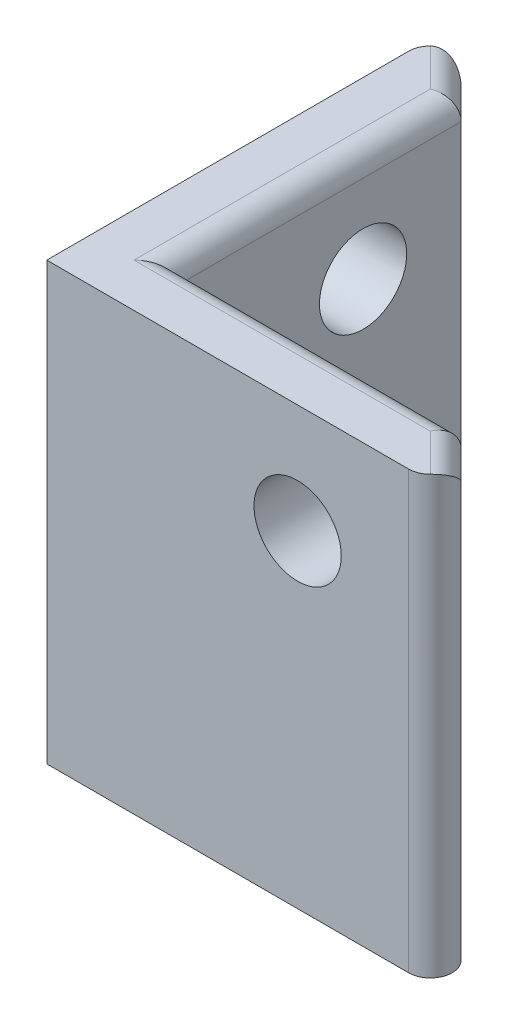
ISO-10303-21;
HEADER;
FILE_DESCRIPTION(('STEP AP214'),'2;1');
FILE_NAME('part.step','',(''),(''),'','','');
FILE_SCHEMA(('AUTOMOTIVE_DESIGN { 1 0 10303 214 1 1 1 1 }'));
ENDSEC;
DATA;
#1=APPLICATION_CONTEXT('core data for automotive mechanical design processes');
#2=APPLICATION_PROTOCOL_DEFINITION('international standard','automotive_design',2000,#1);
#3=PRODUCT_CONTEXT('',#1,'mechanical');
#4=PRODUCT('Part','Part','',(#3));
#5=PRODUCT_RELATED_PRODUCT_CATEGORY('part','',(#4));
#6=PRODUCT_DEFINITION_FORMATION('','',#4);
#7=PRODUCT_DEFINITION_CONTEXT('part definition',#1,'design');
#8=PRODUCT_DEFINITION('design','',#6,#7);
#9=PRODUCT_DEFINITION_SHAPE('','',#8);
#10=(LENGTH_UNIT() NAMED_UNIT(*) SI_UNIT(.MILLI.,.METRE.));
#11=(NAMED_UNIT(*) PLANE_ANGLE_UNIT() SI_UNIT($,.RADIAN.));
#12=(NAMED_UNIT(*) SI_UNIT($,.STERADIAN.) SOLID_ANGLE_UNIT());
#13=UNCERTAINTY_MEASURE_WITH_UNIT(LENGTH_MEASURE(1.E-05),#10,'distance_accuracy_value','');
#14=(GEOMETRIC_REPRESENTATION_CONTEXT(3) GLOBAL_UNCERTAINTY_ASSIGNED_CONTEXT((#13)) GLOBAL_UNIT_ASSIGNED_CONTEXT((#10,
#11,#12)) REPRESENTATION_CONTEXT('',''));
#15=CARTESIAN_POINT('',(0.,0.,0.));
#16=DIRECTION('',(0.,0.,1.));
#17=DIRECTION('',(1.,0.,0.));
#18=AXIS2_PLACEMENT_3D('',#15,#16,#17);
#19=CARTESIAN_POINT('',(0.,5.,0.));
#20=DIRECTION('',(0.,0.,-1.));
#21=DIRECTION('',(-1.,0.,0.));
#22=AXIS2_PLACEMENT_3D('',#19,#20,#21);
#23=PLANE('',#22);
#24=CARTESIAN_POINT('',(11.5,15.,0.));
#25=DIRECTION('',(0.,0.,1.));
#26=DIRECTION('',(1.,0.,0.));
#27=AXIS2_PLACEMENT_3D('',#24,#25,#26);
#28=CIRCLE('',#27,2.);
#29=CARTESIAN_POINT('',(13.5,15.,0.));
#30=VERTEX_POINT('',#29);
#31=EDGE_CURVE('E196',#30,#30,#28,.T.);
#32=ORIENTED_EDGE('',*,*,#31,.F.);
#33=EDGE_LOOP('',(#32));
#34=FACE_BOUND('',#33,.T.);
#35=DIRECTION('',(1.,0.,0.));
#36=VECTOR('',#35,1.);
#37=CARTESIAN_POINT('',(0.,0.,0.));
#38=LINE('',#37,#36);
#39=CARTESIAN_POINT('',(0.,0.,0.));
#40=VERTEX_POINT('',#39);
#41=CARTESIAN_POINT('',(16.5857864376269,0.,0.));
#42=VERTEX_POINT('',#41);
#43=EDGE_CURVE('E214',#40,#42,#38,.T.);
#44=ORIENTED_EDGE('',*,*,#43,.T.);
#45=DIRECTION('',(0.,-1.,0.));
#46=VECTOR('',#45,1.);
#47=CARTESIAN_POINT('',(16.5857864376269,5.,0.));
#48=LINE('',#47,#46);
#49=CARTESIAN_POINT('',(16.5857864376269,20.,0.));
#50=VERTEX_POINT('',#49);
#51=EDGE_CURVE('E42',#42,#50,#48,.F.);
#52=ORIENTED_EDGE('',*,*,#51,.T.);
#53=DIRECTION('',(1.,0.,0.));
#54=VECTOR('',#53,1.);
#55=CARTESIAN_POINT('',(0.,20.,0.));
#56=LINE('',#55,#54);
#57=CARTESIAN_POINT('',(0.,20.,0.));
#58=VERTEX_POINT('',#57);
#59=EDGE_CURVE('E119',#58,#50,#56,.T.);
#60=ORIENTED_EDGE('',*,*,#59,.F.);
#61=DIRECTION('',(0.,-1.,0.));
#62=VECTOR('',#61,1.);
#63=CARTESIAN_POINT('',(0.,5.,0.));
#64=LINE('',#63,#62);
#65=EDGE_CURVE('E126',#58,#40,#64,.T.);
#66=ORIENTED_EDGE('',*,*,#65,.T.);
#67=EDGE_LOOP('',(#44,#52,#60,#66));
#68=FACE_BOUND('',#67,.T.);
#69=ADVANCED_FACE('F33',(#34,#68),#23,.F.);
#70=CARTESIAN_POINT('',(19.,5.,0.));
#71=DIRECTION('',(-0.707106781186548,0.,0.707106781186548));
#72=DIRECTION('',(0.707106781186548,0.,0.707106781186548));
#73=AXIS2_PLACEMENT_3D('',#70,#71,#72);
#74=PLANE('',#73);
#75=DIRECTION('',(0.,-1.,0.));
#76=VECTOR('',#75,1.);
#77=CARTESIAN_POINT('',(16.,20.,-3.));
#78=LINE('',#77,#76);
#79=CARTESIAN_POINT('',(16.,19.,-3.));
#80=VERTEX_POINT('',#79);
#81=CARTESIAN_POINT('',(16.,5.,-3.));
#82=VERTEX_POINT('',#81);
#83=EDGE_CURVE('E217',#80,#82,#78,.T.);
#84=ORIENTED_EDGE('',*,*,#83,.F.);
#85=DIRECTION('',(-0.707106781186548,0.,-0.707106781186548));
#86=VECTOR('',#85,1.);
#87=CARTESIAN_POINT('',(19.,19.,0.));
#88=LINE('',#87,#86);
#89=CARTESIAN_POINT('',(17.2928932188135,19.,-1.70710678118655));
#90=VERTEX_POINT('',#89);
#91=EDGE_CURVE('E165',#80,#90,#88,.F.);
#92=ORIENTED_EDGE('',*,*,#91,.T.);
#93=DIRECTION('',(0.,-1.,0.));
#94=VECTOR('',#93,1.);
#95=CARTESIAN_POINT('',(17.2928932188135,5.,-1.70710678118655));
#96=LINE('',#95,#94);
#97=CARTESIAN_POINT('',(17.2928932188135,0.,-1.70710678118655));
#98=VERTEX_POINT('',#97);
#99=EDGE_CURVE('E163',#90,#98,#96,.T.);
#100=ORIENTED_EDGE('',*,*,#99,.T.);
#101=DIRECTION('',(-0.707106781186548,0.,-0.707106781186548));
#102=VECTOR('',#101,1.);
#103=CARTESIAN_POINT('',(19.,0.,0.));
#104=LINE('',#103,#102);
#105=CARTESIAN_POINT('',(1.70710678118655,0.,-17.2928932188135));
#106=VERTEX_POINT('',#105);
#107=EDGE_CURVE('E216',#98,#106,#104,.T.);
#108=ORIENTED_EDGE('',*,*,#107,.T.);
#109=DIRECTION('',(0.,-1.,0.));
#110=VECTOR('',#109,1.);
#111=CARTESIAN_POINT('',(1.70710678118655,5.,-17.2928932188134));
#112=LINE('',#111,#110);
#113=CARTESIAN_POINT('',(1.70710678118655,19.,-17.2928932188135));
#114=VERTEX_POINT('',#113);
#115=EDGE_CURVE('E159',#106,#114,#112,.F.);
#116=ORIENTED_EDGE('',*,*,#115,.T.);
#117=DIRECTION('',(-0.707106781186548,0.,-0.707106781186548));
#118=VECTOR('',#117,1.);
#119=CARTESIAN_POINT('',(3.,19.,-16.));
#120=LINE('',#119,#118);
#121=CARTESIAN_POINT('',(3.,19.,-16.));
#122=VERTEX_POINT('',#121);
#123=EDGE_CURVE('E161',#114,#122,#120,.F.);
#124=ORIENTED_EDGE('',*,*,#123,.T.);
#125=DIRECTION('',(0.,-1.,0.));
#126=VECTOR('',#125,1.);
#127=CARTESIAN_POINT('',(3.,20.,-16.));
#128=LINE('',#127,#126);
#129=CARTESIAN_POINT('',(3.,5.,-16.));
#130=VERTEX_POINT('',#129);
#131=EDGE_CURVE('E133',#122,#130,#128,.T.);
#132=ORIENTED_EDGE('',*,*,#131,.T.);
#133=DIRECTION('',(-0.707106781186548,0.,-0.707106781186548));
#134=VECTOR('',#133,1.);
#135=CARTESIAN_POINT('',(19.,5.,0.));
#136=LINE('',#135,#134);
#137=EDGE_CURVE('E130',#82,#130,#136,.T.);
#138=ORIENTED_EDGE('',*,*,#137,.F.);
#139=EDGE_LOOP('',(#84,#92,#100,#108,#116,#124,#132,#138));
#140=FACE_BOUND('',#139,.T.);
#141=ADVANCED_FACE('F222',(#140),#74,.F.);
#142=CARTESIAN_POINT('',(0.,5.,0.));
#143=DIRECTION('',(1.,0.,0.));
#144=DIRECTION('',(0.,0.,-1.));
#145=AXIS2_PLACEMENT_3D('',#142,#143,#144);
#146=PLANE('',#145);
#147=CARTESIAN_POINT('',(0.,15.,-11.5));
#148=DIRECTION('',(-1.,0.,0.));
#149=DIRECTION('',(0.,0.,1.));
#150=AXIS2_PLACEMENT_3D('',#147,#148,#149);
#151=CIRCLE('',#150,2.);
#152=CARTESIAN_POINT('',(0.,15.,-9.5));
#153=VERTEX_POINT('',#152);
#154=EDGE_CURVE('E185',#153,#153,#151,.T.);
#155=ORIENTED_EDGE('',*,*,#154,.F.);
#156=EDGE_LOOP('',(#155));
#157=FACE_BOUND('',#156,.T.);
#158=DIRECTION('',(0.,0.,1.));
#159=VECTOR('',#158,1.);
#160=CARTESIAN_POINT('',(0.,20.,-19.));
#161=LINE('',#160,#159);
#162=CARTESIAN_POINT('',(0.,20.,-16.5857864376269));
#163=VERTEX_POINT('',#162);
#164=EDGE_CURVE('E115',#163,#58,#161,.T.);
#165=ORIENTED_EDGE('',*,*,#164,.F.);
#166=DIRECTION('',(0.,-1.,0.));
#167=VECTOR('',#166,1.);
#168=CARTESIAN_POINT('',(0.,5.,-16.5857864376269));
#169=LINE('',#168,#167);
#170=CARTESIAN_POINT('',(0.,0.,-16.5857864376269));
#171=VERTEX_POINT('',#170);
#172=EDGE_CURVE('E11',#163,#171,#169,.T.);
#173=ORIENTED_EDGE('',*,*,#172,.T.);
#174=DIRECTION('',(0.,0.,1.));
#175=VECTOR('',#174,1.);
#176=CARTESIAN_POINT('',(0.,0.,0.));
#177=LINE('',#176,#175);
#178=EDGE_CURVE('E128',#171,#40,#177,.T.);
#179=ORIENTED_EDGE('',*,*,#178,.T.);
#180=ORIENTED_EDGE('',*,*,#65,.F.);
#181=EDGE_LOOP('',(#165,#173,#179,#180));
#182=FACE_BOUND('',#181,.T.);
#183=ADVANCED_FACE('F127',(#157,#182),#146,.F.);
#184=CARTESIAN_POINT('',(0.,5.,0.));
#185=DIRECTION('',(0.,1.,0.));
#186=DIRECTION('',(0.,0.,1.));
#187=AXIS2_PLACEMENT_3D('',#184,#185,#186);
#188=PLANE('',#187);
#189=DIRECTION('',(0.,0.,-1.));
#190=VECTOR('',#189,1.);
#191=CARTESIAN_POINT('',(3.,5.,-3.));
#192=LINE('',#191,#190);
#193=CARTESIAN_POINT('',(3.,5.,-3.));
#194=VERTEX_POINT('',#193);
#195=EDGE_CURVE('E123',#194,#130,#192,.T.);
#196=ORIENTED_EDGE('',*,*,#195,.F.);
#197=DIRECTION('',(-1.,0.,0.));
#198=VECTOR('',#197,1.);
#199=CARTESIAN_POINT('',(16.,5.,-3.));
#200=LINE('',#199,#198);
#201=EDGE_CURVE('E146',#82,#194,#200,.T.);
#202=ORIENTED_EDGE('',*,*,#201,.F.);
#203=ORIENTED_EDGE('',*,*,#137,.T.);
#204=EDGE_LOOP('',(#196,#202,#203));
#205=FACE_BOUND('',#204,.T.);
#206=ADVANCED_FACE('F235',(#205),#188,.T.);
#207=CARTESIAN_POINT('',(0.,0.,0.));
#208=DIRECTION('',(0.,1.,0.));
#209=DIRECTION('',(0.,0.,1.));
#210=AXIS2_PLACEMENT_3D('',#207,#208,#209);
#211=PLANE('',#210);
#212=ORIENTED_EDGE('',*,*,#107,.F.);
#213=CARTESIAN_POINT('',(16.5857864376269,0.,-1.));
#214=DIRECTION('',(0.,1.,0.));
#215=DIRECTION('',(0.,0.,1.));
#216=AXIS2_PLACEMENT_3D('',#213,#214,#215);
#217=CIRCLE('',#216,1.);
#218=EDGE_CURVE('E56',#98,#42,#217,.F.);
#219=ORIENTED_EDGE('',*,*,#218,.T.);
#220=ORIENTED_EDGE('',*,*,#43,.F.);
#221=ORIENTED_EDGE('',*,*,#178,.F.);
#222=CARTESIAN_POINT('',(1.,0.,-16.5857864376269));
#223=DIRECTION('',(0.,1.,0.));
#224=DIRECTION('',(0.,0.,1.));
#225=AXIS2_PLACEMENT_3D('',#222,#223,#224);
#226=CIRCLE('',#225,1.);
#227=EDGE_CURVE('E167',#171,#106,#226,.F.);
#228=ORIENTED_EDGE('',*,*,#227,.T.);
#229=EDGE_LOOP('',(#212,#219,#220,#221,#228));
#230=FACE_BOUND('',#229,.T.);
#231=ADVANCED_FACE('F257',(#230),#211,.F.);
#232=CARTESIAN_POINT('',(16.,20.,-3.));
#233=DIRECTION('',(0.,0.,1.));
#234=DIRECTION('',(1.,0.,0.));
#235=AXIS2_PLACEMENT_3D('',#232,#233,#234);
#236=PLANE('',#235);
#237=CARTESIAN_POINT('',(11.5,15.,-3.));
#238=DIRECTION('',(0.,0.,1.));
#239=DIRECTION('',(1.,0.,0.));
#240=AXIS2_PLACEMENT_3D('',#237,#238,#239);
#241=CIRCLE('',#240,2.);
#242=CARTESIAN_POINT('',(13.5,15.,-3.));
#243=VERTEX_POINT('',#242);
#244=EDGE_CURVE('E151',#243,#243,#241,.T.);
#245=ORIENTED_EDGE('',*,*,#244,.T.);
#246=EDGE_LOOP('',(#245));
#247=FACE_BOUND('',#246,.T.);
#248=DIRECTION('',(0.,-1.,0.));
#249=VECTOR('',#248,1.);
#250=CARTESIAN_POINT('',(3.,20.,-3.));
#251=LINE('',#250,#249);
#252=CARTESIAN_POINT('',(3.,19.,-3.));
#253=VERTEX_POINT('',#252);
#254=EDGE_CURVE('E135',#253,#194,#251,.T.);
#255=ORIENTED_EDGE('',*,*,#254,.F.);
#256=DIRECTION('',(-1.,0.,0.));
#257=VECTOR('',#256,1.);
#258=CARTESIAN_POINT('',(16.,19.,-3.));
#259=LINE('',#258,#257);
#260=EDGE_CURVE('E155',#253,#80,#259,.F.);
#261=ORIENTED_EDGE('',*,*,#260,.T.);
#262=ORIENTED_EDGE('',*,*,#83,.T.);
#263=ORIENTED_EDGE('',*,*,#201,.T.);
#264=EDGE_LOOP('',(#255,#261,#262,#263));
#265=FACE_BOUND('',#264,.T.);
#266=ADVANCED_FACE('F255',(#247,#265),#236,.F.);
#267=CARTESIAN_POINT('',(3.,20.,-3.));
#268=DIRECTION('',(-1.,0.,0.));
#269=DIRECTION('',(0.,0.,1.));
#270=AXIS2_PLACEMENT_3D('',#267,#268,#269);
#271=PLANE('',#270);
#272=CARTESIAN_POINT('',(3.,15.,-11.5));
#273=DIRECTION('',(-1.,0.,0.));
#274=DIRECTION('',(0.,0.,1.));
#275=AXIS2_PLACEMENT_3D('',#272,#273,#274);
#276=CIRCLE('',#275,2.);
#277=CARTESIAN_POINT('',(3.,15.,-9.5));
#278=VERTEX_POINT('',#277);
#279=EDGE_CURVE('E191',#278,#278,#276,.T.);
#280=ORIENTED_EDGE('',*,*,#279,.T.);
#281=EDGE_LOOP('',(#280));
#282=FACE_BOUND('',#281,.T.);
#283=ORIENTED_EDGE('',*,*,#131,.F.);
#284=DIRECTION('',(0.,0.,-1.));
#285=VECTOR('',#284,1.);
#286=CARTESIAN_POINT('',(3.,19.,-3.));
#287=LINE('',#286,#285);
#288=EDGE_CURVE('E157',#122,#253,#287,.F.);
#289=ORIENTED_EDGE('',*,*,#288,.T.);
#290=ORIENTED_EDGE('',*,*,#254,.T.);
#291=ORIENTED_EDGE('',*,*,#195,.T.);
#292=EDGE_LOOP('',(#283,#289,#290,#291));
#293=FACE_BOUND('',#292,.T.);
#294=ADVANCED_FACE('F232',(#282,#293),#271,.F.);
#295=CARTESIAN_POINT('',(0.,20.,0.));
#296=DIRECTION('',(0.,1.,0.));
#297=DIRECTION('',(0.,0.,1.));
#298=AXIS2_PLACEMENT_3D('',#295,#296,#297);
#299=PLANE('',#298);
#300=ORIENTED_EDGE('',*,*,#59,.T.);
#301=CARTESIAN_POINT('',(16.5857864376269,20.,-1.));
#302=DIRECTION('',(0.,1.,0.));
#303=DIRECTION('',(0.,0.,1.));
#304=AXIS2_PLACEMENT_3D('',#301,#302,#303);
#305=CIRCLE('',#304,1.);
#306=CARTESIAN_POINT('',(17.2928932188135,20.,-0.292893218813452));
#307=VERTEX_POINT('',#306);
#308=EDGE_CURVE('E249',#50,#307,#305,.T.);
#309=ORIENTED_EDGE('',*,*,#308,.T.);
#310=DIRECTION('',(-0.707106781186548,0.,-0.707106781186548));
#311=VECTOR('',#310,1.);
#312=CARTESIAN_POINT('',(15.2928932188135,20.,-2.29289321881345));
#313=LINE('',#312,#311);
#314=CARTESIAN_POINT('',(15.5857864376269,20.,-2.));
#315=VERTEX_POINT('',#314);
#316=EDGE_CURVE('E246',#307,#315,#313,.T.);
#317=ORIENTED_EDGE('',*,*,#316,.T.);
#318=DIRECTION('',(-1.,0.,0.));
#319=VECTOR('',#318,1.);
#320=CARTESIAN_POINT('',(3.,20.,-2.));
#321=LINE('',#320,#319);
#322=CARTESIAN_POINT('',(2.,20.,-2.));
#323=VERTEX_POINT('',#322);
#324=EDGE_CURVE('E244',#315,#323,#321,.T.);
#325=ORIENTED_EDGE('',*,*,#324,.T.);
#326=DIRECTION('',(0.,0.,-1.));
#327=VECTOR('',#326,1.);
#328=CARTESIAN_POINT('',(2.,20.,-16.));
#329=LINE('',#328,#327);
#330=CARTESIAN_POINT('',(2.,20.,-15.5857864376269));
#331=VERTEX_POINT('',#330);
#332=EDGE_CURVE('E247',#323,#331,#329,.T.);
#333=ORIENTED_EDGE('',*,*,#332,.T.);
#334=DIRECTION('',(-0.707106781186548,0.,-0.707106781186548));
#335=VECTOR('',#334,1.);
#336=CARTESIAN_POINT('',(-0.70710678118655,20.,-18.2928932188135));
#337=LINE('',#336,#335);
#338=CARTESIAN_POINT('',(0.292893218813452,20.,-17.2928932188135));
#339=VERTEX_POINT('',#338);
#340=EDGE_CURVE('E251',#331,#339,#337,.T.);
#341=ORIENTED_EDGE('',*,*,#340,.T.);
#342=CARTESIAN_POINT('',(1.,20.,-16.5857864376269));
#343=DIRECTION('',(0.,1.,0.));
#344=DIRECTION('',(0.,0.,1.));
#345=AXIS2_PLACEMENT_3D('',#342,#343,#344);
#346=CIRCLE('',#345,1.);
#347=EDGE_CURVE('E122',#339,#163,#346,.T.);
#348=ORIENTED_EDGE('',*,*,#347,.T.);
#349=ORIENTED_EDGE('',*,*,#164,.T.);
#350=EDGE_LOOP('',(#300,#309,#317,#325,#333,#341,#348,#349));
#351=FACE_BOUND('',#350,.T.);
#352=ADVANCED_FACE('F117',(#351),#299,.T.);
#353=CARTESIAN_POINT('',(11.5,15.,-19.));
#354=DIRECTION('',(0.,0.,1.));
#355=DIRECTION('',(1.,0.,0.));
#356=AXIS2_PLACEMENT_3D('',#353,#354,#355);
#357=CYLINDRICAL_SURFACE('',#356,2.);
#358=ORIENTED_EDGE('',*,*,#31,.T.);
#359=EDGE_LOOP('',(#358));
#360=FACE_BOUND('',#359,.T.);
#361=ORIENTED_EDGE('',*,*,#244,.F.);
#362=EDGE_LOOP('',(#361));
#363=FACE_BOUND('',#362,.T.);
#364=ADVANCED_FACE('F295',(#360,#363),#357,.F.);
#365=CARTESIAN_POINT('',(19.,15.,-11.5));
#366=DIRECTION('',(-1.,0.,0.));
#367=DIRECTION('',(0.,0.,1.));
#368=AXIS2_PLACEMENT_3D('',#365,#366,#367);
#369=CYLINDRICAL_SURFACE('',#368,2.);
#370=ORIENTED_EDGE('',*,*,#154,.T.);
#371=EDGE_LOOP('',(#370));
#372=FACE_BOUND('',#371,.T.);
#373=ORIENTED_EDGE('',*,*,#279,.F.);
#374=EDGE_LOOP('',(#373));
#375=FACE_BOUND('',#374,.T.);
#376=ADVANCED_FACE('F291',(#372,#375),#369,.F.);
#377=CARTESIAN_POINT('',(1.,5.,-16.5857864376269));
#378=DIRECTION('',(0.,-1.,0.));
#379=DIRECTION('',(0.,0.,-1.));
#380=AXIS2_PLACEMENT_3D('',#377,#378,#379);
#381=CYLINDRICAL_SURFACE('',#380,1.);
#382=ORIENTED_EDGE('',*,*,#172,.F.);
#383=ORIENTED_EDGE('',*,*,#347,.F.);
#384=CARTESIAN_POINT('',(1.,19.,-16.5857864376269));
#385=DIRECTION('',(-0.5,-0.707106781186547,-0.5));
#386=DIRECTION('',(0.5,-0.707106781186547,0.5));
#387=AXIS2_PLACEMENT_3D('',#384,#385,#386);
#388=ELLIPSE('',#387,1.41421356237309,1.);
#389=EDGE_CURVE('E37',#114,#339,#388,.F.);
#390=ORIENTED_EDGE('',*,*,#389,.F.);
#391=ORIENTED_EDGE('',*,*,#115,.F.);
#392=ORIENTED_EDGE('',*,*,#227,.F.);
#393=EDGE_LOOP('',(#382,#383,#390,#391,#392));
#394=FACE_BOUND('',#393,.T.);
#395=ADVANCED_FACE('F35',(#394),#381,.T.);
#396=CARTESIAN_POINT('',(16.5857864376269,5.,-1.));
#397=DIRECTION('',(0.,-1.,0.));
#398=DIRECTION('',(0.,0.,-1.));
#399=AXIS2_PLACEMENT_3D('',#396,#397,#398);
#400=CYLINDRICAL_SURFACE('',#399,1.);
#401=ORIENTED_EDGE('',*,*,#218,.F.);
#402=ORIENTED_EDGE('',*,*,#99,.F.);
#403=CARTESIAN_POINT('',(16.5857864376269,19.,-1.));
#404=DIRECTION('',(0.5,-0.707106781186547,0.5));
#405=DIRECTION('',(-0.5,-0.707106781186547,-0.5));
#406=AXIS2_PLACEMENT_3D('',#403,#404,#405);
#407=ELLIPSE('',#406,1.41421356237309,1.);
#408=EDGE_CURVE('E178',#307,#90,#407,.F.);
#409=ORIENTED_EDGE('',*,*,#408,.F.);
#410=ORIENTED_EDGE('',*,*,#308,.F.);
#411=ORIENTED_EDGE('',*,*,#51,.F.);
#412=EDGE_LOOP('',(#401,#402,#409,#410,#411));
#413=FACE_BOUND('',#412,.T.);
#414=ADVANCED_FACE('F285',(#413),#400,.T.);
#415=CARTESIAN_POINT('',(8.79289321881345,19.,-8.79289321881345));
#416=DIRECTION('',(0.707106781186548,0.,0.707106781186548));
#417=DIRECTION('',(0.707106781186548,0.,-0.707106781186548));
#418=AXIS2_PLACEMENT_3D('',#415,#416,#417);
#419=CYLINDRICAL_SURFACE('',#418,1.);
#420=ORIENTED_EDGE('',*,*,#389,.T.);
#421=ORIENTED_EDGE('',*,*,#340,.F.);
#422=CARTESIAN_POINT('',(2.,19.,-15.5857864376269));
#423=DIRECTION('',(0.38268343236509,0.,0.923879532511287));
#424=DIRECTION('',(0.923879532511287,0.,-0.38268343236509));
#425=AXIS2_PLACEMENT_3D('',#422,#423,#424);
#426=ELLIPSE('',#425,1.08239220029239,1.);
#427=EDGE_CURVE('E176',#122,#331,#426,.T.);
#428=ORIENTED_EDGE('',*,*,#427,.F.);
#429=ORIENTED_EDGE('',*,*,#123,.F.);
#430=EDGE_LOOP('',(#420,#421,#428,#429));
#431=FACE_BOUND('',#430,.T.);
#432=ADVANCED_FACE('F227',(#431),#419,.T.);
#433=CARTESIAN_POINT('',(8.79289321881345,19.,-8.79289321881345));
#434=DIRECTION('',(0.707106781186548,0.,0.707106781186548));
#435=DIRECTION('',(0.707106781186548,0.,-0.707106781186548));
#436=AXIS2_PLACEMENT_3D('',#433,#434,#435);
#437=CYLINDRICAL_SURFACE('',#436,1.);
#438=ORIENTED_EDGE('',*,*,#408,.T.);
#439=ORIENTED_EDGE('',*,*,#91,.F.);
#440=CARTESIAN_POINT('',(15.5857864376269,19.,-2.));
#441=DIRECTION('',(0.923879532511287,0.,0.38268343236509));
#442=DIRECTION('',(-0.38268343236509,0.,0.923879532511287));
#443=AXIS2_PLACEMENT_3D('',#440,#441,#442);
#444=ELLIPSE('',#443,1.08239220029239,1.);
#445=EDGE_CURVE('E173',#315,#80,#444,.F.);
#446=ORIENTED_EDGE('',*,*,#445,.F.);
#447=ORIENTED_EDGE('',*,*,#316,.F.);
#448=EDGE_LOOP('',(#438,#439,#446,#447));
#449=FACE_BOUND('',#448,.T.);
#450=ADVANCED_FACE('F237',(#449),#437,.T.);
#451=CARTESIAN_POINT('',(2.,19.,0.));
#452=DIRECTION('',(0.,0.,1.));
#453=DIRECTION('',(1.,0.,0.));
#454=AXIS2_PLACEMENT_3D('',#451,#452,#453);
#455=CYLINDRICAL_SURFACE('',#454,1.);
#456=ORIENTED_EDGE('',*,*,#427,.T.);
#457=ORIENTED_EDGE('',*,*,#332,.F.);
#458=CARTESIAN_POINT('',(2.,19.,-2.));
#459=DIRECTION('',(0.707106781186547,0.,0.707106781186548));
#460=DIRECTION('',(0.707106781186547,0.,-0.707106781186547));
#461=AXIS2_PLACEMENT_3D('',#458,#459,#460);
#462=ELLIPSE('',#461,1.4142135623731,1.);
#463=EDGE_CURVE('E171',#253,#323,#462,.T.);
#464=ORIENTED_EDGE('',*,*,#463,.F.);
#465=ORIENTED_EDGE('',*,*,#288,.F.);
#466=EDGE_LOOP('',(#456,#457,#464,#465));
#467=FACE_BOUND('',#466,.T.);
#468=ADVANCED_FACE('F278',(#467),#455,.T.);
#469=CARTESIAN_POINT('',(0.,19.,-2.));
#470=DIRECTION('',(1.,0.,0.));
#471=DIRECTION('',(0.,0.,-1.));
#472=AXIS2_PLACEMENT_3D('',#469,#470,#471);
#473=CYLINDRICAL_SURFACE('',#472,1.);
#474=ORIENTED_EDGE('',*,*,#445,.T.);
#475=ORIENTED_EDGE('',*,*,#260,.F.);
#476=ORIENTED_EDGE('',*,*,#463,.T.);
#477=ORIENTED_EDGE('',*,*,#324,.F.);
#478=EDGE_LOOP('',(#474,#475,#476,#477));
#479=FACE_BOUND('',#478,.T.);
#480=ADVANCED_FACE('F241',(#479),#473,.T.);
#481=CLOSED_SHELL('',(#69,#141,#183,#206,#231,#266,#294,#352,#364,#376,#395,#414,#432,#450,#468,#480));
#482=MANIFOLD_SOLID_BREP('B2',#481);
#483=ADVANCED_BREP_SHAPE_REPRESENTATION('',(#18,#482),#14);
#484=SHAPE_DEFINITION_REPRESENTATION(#9,#483);
ENDSEC;
END-ISO-10303-21;
